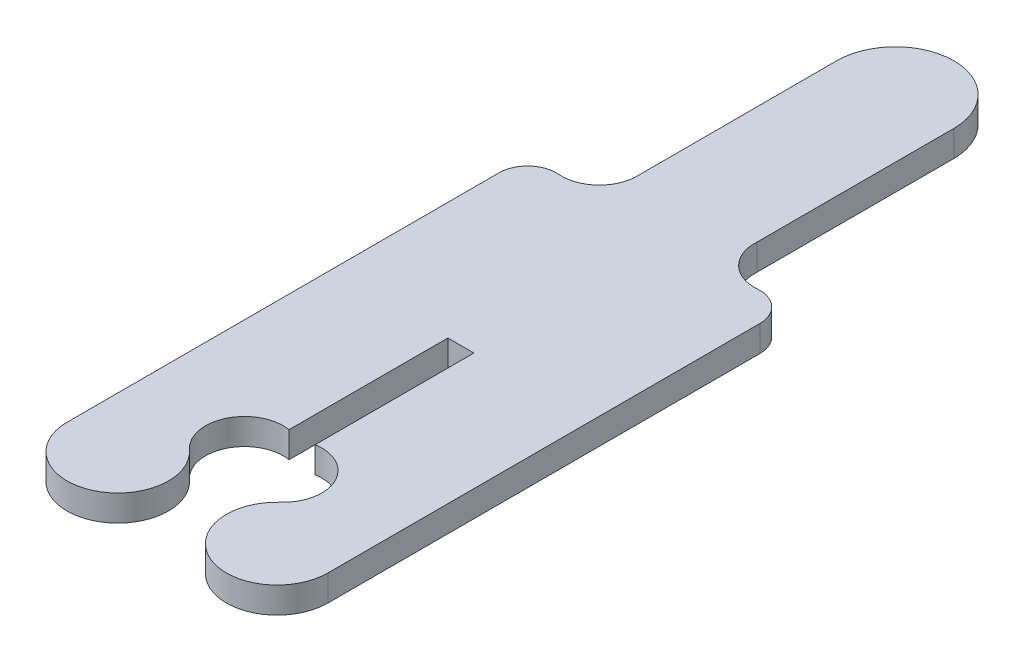
ISO-10303-21;
HEADER;
FILE_DESCRIPTION(('STEP AP214'),'2;1');
FILE_NAME('part.step','',(''),(''),'','','');
FILE_SCHEMA(('AUTOMOTIVE_DESIGN { 1 0 10303 214 1 1 1 1 }'));
ENDSEC;
DATA;
#1=APPLICATION_CONTEXT('core data for automotive mechanical design processes');
#2=APPLICATION_PROTOCOL_DEFINITION('international standard','automotive_design',2000,#1);
#3=PRODUCT_CONTEXT('',#1,'mechanical');
#4=PRODUCT('Part','Part','',(#3));
#5=PRODUCT_RELATED_PRODUCT_CATEGORY('part','',(#4));
#6=PRODUCT_DEFINITION_FORMATION('','',#4);
#7=PRODUCT_DEFINITION_CONTEXT('part definition',#1,'design');
#8=PRODUCT_DEFINITION('design','',#6,#7);
#9=PRODUCT_DEFINITION_SHAPE('','',#8);
#10=(LENGTH_UNIT() NAMED_UNIT(*) SI_UNIT(.MILLI.,.METRE.));
#11=(NAMED_UNIT(*) PLANE_ANGLE_UNIT() SI_UNIT($,.RADIAN.));
#12=(NAMED_UNIT(*) SI_UNIT($,.STERADIAN.) SOLID_ANGLE_UNIT());
#13=UNCERTAINTY_MEASURE_WITH_UNIT(LENGTH_MEASURE(1.E-05),#10,'distance_accuracy_value','');
#14=(GEOMETRIC_REPRESENTATION_CONTEXT(3) GLOBAL_UNCERTAINTY_ASSIGNED_CONTEXT((#13)) GLOBAL_UNIT_ASSIGNED_CONTEXT((#10,
#11,#12)) REPRESENTATION_CONTEXT('',''));
#15=CARTESIAN_POINT('',(0.,0.,0.));
#16=DIRECTION('',(0.,0.,1.));
#17=DIRECTION('',(1.,0.,0.));
#18=AXIS2_PLACEMENT_3D('',#15,#16,#17);
#19=CARTESIAN_POINT('',(-41777.0225889867,3.,-18289.7814477711));
#20=DIRECTION('',(0.,-1.,0.));
#21=DIRECTION('',(0.,0.,-1.));
#22=AXIS2_PLACEMENT_3D('',#19,#20,#21);
#23=CYLINDRICAL_SURFACE('',#22,4.47729575940053);
#24=CARTESIAN_POINT('',(-41777.0225889867,0.,-18289.7814477711));
#25=DIRECTION('',(0.,-1.,0.));
#26=DIRECTION('',(0.,0.,1.));
#27=AXIS2_PLACEMENT_3D('',#24,#25,#26);
#28=CIRCLE('',#27,4.47729575940053);
#29=CARTESIAN_POINT('',(-41777.738281,0.,-18294.201172));
#30=VERTEX_POINT('',#29);
#31=CARTESIAN_POINT('',(-41774.003968,0.,-18286.474772));
#32=VERTEX_POINT('',#31);
#33=EDGE_CURVE('E179',#30,#32,#28,.T.);
#34=ORIENTED_EDGE('',*,*,#33,.T.);
#35=DIRECTION('',(0.,-1.,0.));
#36=VECTOR('',#35,1.);
#37=CARTESIAN_POINT('',(-41774.003968,3.,-18286.474772));
#38=LINE('',#37,#36);
#39=CARTESIAN_POINT('',(-41774.003968,3.,-18286.474772));
#40=VERTEX_POINT('',#39);
#41=EDGE_CURVE('E11',#40,#32,#38,.T.);
#42=ORIENTED_EDGE('',*,*,#41,.F.);
#43=CARTESIAN_POINT('',(-41777.0225889867,3.,-18289.7814477711));
#44=DIRECTION('',(0.,-1.,0.));
#45=DIRECTION('',(0.,0.,1.));
#46=AXIS2_PLACEMENT_3D('',#43,#44,#45);
#47=CIRCLE('',#46,4.47729575940053);
#48=CARTESIAN_POINT('',(-41777.738281,3.,-18294.201172));
#49=VERTEX_POINT('',#48);
#50=EDGE_CURVE('E209',#49,#40,#47,.T.);
#51=ORIENTED_EDGE('',*,*,#50,.F.);
#52=DIRECTION('',(0.,-1.,0.));
#53=VECTOR('',#52,1.);
#54=CARTESIAN_POINT('',(-41777.738281,3.,-18294.201172));
#55=LINE('',#54,#53);
#56=EDGE_CURVE('E175',#49,#30,#55,.T.);
#57=ORIENTED_EDGE('',*,*,#56,.T.);
#58=EDGE_LOOP('',(#34,#42,#51,#57));
#59=FACE_BOUND('',#58,.T.);
#60=ADVANCED_FACE('F35',(#59),#23,.F.);
#61=CARTESIAN_POINT('',(-41770.0709351856,3.,-18282.1623839728));
#62=DIRECTION('',(0.,-1.,0.));
#63=DIRECTION('',(0.,0.,-1.));
#64=AXIS2_PLACEMENT_3D('',#61,#62,#63);
#65=CYLINDRICAL_SURFACE('',#64,5.83656042680733);
#66=CARTESIAN_POINT('',(-41770.0709351856,0.,-18282.1623839728));
#67=DIRECTION('',(0.,1.,0.));
#68=DIRECTION('',(0.,0.,1.));
#69=AXIS2_PLACEMENT_3D('',#66,#67,#68);
#70=CIRCLE('',#69,5.83656042680733);
#71=CARTESIAN_POINT('',(-41764.234375,0.,-18282.164062));
#72=VERTEX_POINT('',#71);
#73=EDGE_CURVE('E182',#32,#72,#70,.T.);
#74=ORIENTED_EDGE('',*,*,#73,.T.);
#75=DIRECTION('',(0.,-1.,0.));
#76=VECTOR('',#75,1.);
#77=CARTESIAN_POINT('',(-41764.234375,3.,-18282.164062));
#78=LINE('',#77,#76);
#79=CARTESIAN_POINT('',(-41764.234375,3.,-18282.164062));
#80=VERTEX_POINT('',#79);
#81=EDGE_CURVE('E43',#80,#72,#78,.T.);
#82=ORIENTED_EDGE('',*,*,#81,.F.);
#83=CARTESIAN_POINT('',(-41770.0709351856,3.,-18282.1623839728));
#84=DIRECTION('',(0.,1.,0.));
#85=DIRECTION('',(0.,0.,1.));
#86=AXIS2_PLACEMENT_3D('',#83,#84,#85);
#87=CIRCLE('',#86,5.83656042680733);
#88=EDGE_CURVE('E118',#40,#80,#87,.T.);
#89=ORIENTED_EDGE('',*,*,#88,.F.);
#90=ORIENTED_EDGE('',*,*,#41,.T.);
#91=EDGE_LOOP('',(#74,#82,#89,#90));
#92=FACE_BOUND('',#91,.T.);
#93=ADVANCED_FACE('F307',(#92),#65,.T.);
#94=CARTESIAN_POINT('',(-41764.2415839999,3.,-18331.840166));
#95=DIRECTION('',(-0.999999989470082,0.,0.000145120072777527));
#96=DIRECTION('',(0.000145120072777527,0.,0.999999989470082));
#97=AXIS2_PLACEMENT_3D('',#94,#95,#96);
#98=PLANE('',#97);
#99=DIRECTION('',(-0.000145120072777527,0.,-0.999999989470082));
#100=VECTOR('',#99,1.);
#101=CARTESIAN_POINT('',(-41764.2415839999,0.,-18331.840166));
#102=LINE('',#101,#100);
#103=CARTESIAN_POINT('',(-41764.2415839999,0.,-18331.840166));
#104=VERTEX_POINT('',#103);
#105=EDGE_CURVE('E184',#72,#104,#102,.T.);
#106=ORIENTED_EDGE('',*,*,#105,.T.);
#107=DIRECTION('',(0.,-1.,0.));
#108=VECTOR('',#107,1.);
#109=CARTESIAN_POINT('',(-41764.2415839999,3.,-18331.840166));
#110=LINE('',#109,#108);
#111=CARTESIAN_POINT('',(-41764.2415839999,3.,-18331.840166));
#112=VERTEX_POINT('',#111);
#113=EDGE_CURVE('E240',#112,#104,#110,.T.);
#114=ORIENTED_EDGE('',*,*,#113,.F.);
#115=DIRECTION('',(-0.000145120072777527,0.,-0.999999989470082));
#116=VECTOR('',#115,1.);
#117=CARTESIAN_POINT('',(-41764.2415839999,3.,-18331.840166));
#118=LINE('',#117,#116);
#119=EDGE_CURVE('E248',#80,#112,#118,.T.);
#120=ORIENTED_EDGE('',*,*,#119,.F.);
#121=ORIENTED_EDGE('',*,*,#81,.T.);
#122=EDGE_LOOP('',(#106,#114,#120,#121));
#123=FACE_BOUND('',#122,.T.);
#124=ADVANCED_FACE('F246',(#123),#98,.F.);
#125=CARTESIAN_POINT('',(-41767.5394138388,3.,-18331.8401681486));
#126=DIRECTION('',(0.,-1.,0.));
#127=DIRECTION('',(0.,0.,-1.));
#128=AXIS2_PLACEMENT_3D('',#125,#126,#127);
#129=CYLINDRICAL_SURFACE('',#128,3.29782983887451);
#130=CARTESIAN_POINT('',(-41767.5394138388,0.,-18331.8401681486));
#131=DIRECTION('',(0.,1.,0.));
#132=DIRECTION('',(0.,0.,1.));
#133=AXIS2_PLACEMENT_3D('',#130,#131,#132);
#134=CIRCLE('',#133,3.29782983887451);
#135=CARTESIAN_POINT('',(-41767.8091419999,0.,-18335.126949));
#136=VERTEX_POINT('',#135);
#137=EDGE_CURVE('E186',#104,#136,#134,.T.);
#138=ORIENTED_EDGE('',*,*,#137,.T.);
#139=DIRECTION('',(0.,-1.,0.));
#140=VECTOR('',#139,1.);
#141=CARTESIAN_POINT('',(-41767.8091419999,3.,-18335.126949));
#142=LINE('',#141,#140);
#143=CARTESIAN_POINT('',(-41767.8091419999,3.,-18335.126949));
#144=VERTEX_POINT('',#143);
#145=EDGE_CURVE('E237',#144,#136,#142,.T.);
#146=ORIENTED_EDGE('',*,*,#145,.F.);
#147=CARTESIAN_POINT('',(-41767.5394138388,3.,-18331.8401681486));
#148=DIRECTION('',(0.,1.,0.));
#149=DIRECTION('',(0.,0.,1.));
#150=AXIS2_PLACEMENT_3D('',#147,#148,#149);
#151=CIRCLE('',#150,3.29782983887451);
#152=EDGE_CURVE('E266',#112,#144,#151,.T.);
#153=ORIENTED_EDGE('',*,*,#152,.F.);
#154=ORIENTED_EDGE('',*,*,#113,.T.);
#155=EDGE_LOOP('',(#138,#146,#153,#154));
#156=FACE_BOUND('',#155,.T.);
#157=ADVANCED_FACE('F257',(#156),#129,.T.);
#158=CARTESIAN_POINT('',(-41768.156767907,3.,-18339.477072009));
#159=DIRECTION('',(0.,-1.,0.));
#160=DIRECTION('',(0.,0.,-1.));
#161=AXIS2_PLACEMENT_3D('',#158,#159,#160);
#162=CYLINDRICAL_SURFACE('',#161,4.36399060089842);
#163=CARTESIAN_POINT('',(-41768.156767907,0.,-18339.477072009));
#164=DIRECTION('',(0.,-1.,0.));
#165=DIRECTION('',(0.,0.,1.));
#166=AXIS2_PLACEMENT_3D('',#163,#164,#165);
#167=CIRCLE('',#166,4.36399060089842);
#168=CARTESIAN_POINT('',(-41772.511719,0.,-18339.757812));
#169=VERTEX_POINT('',#168);
#170=EDGE_CURVE('E188',#136,#169,#167,.T.);
#171=ORIENTED_EDGE('',*,*,#170,.T.);
#172=DIRECTION('',(0.,-1.,0.));
#173=VECTOR('',#172,1.);
#174=CARTESIAN_POINT('',(-41772.511719,3.,-18339.757812));
#175=LINE('',#174,#173);
#176=CARTESIAN_POINT('',(-41772.511719,3.,-18339.757812));
#177=VERTEX_POINT('',#176);
#178=EDGE_CURVE('E234',#177,#169,#175,.T.);
#179=ORIENTED_EDGE('',*,*,#178,.F.);
#180=CARTESIAN_POINT('',(-41768.156767907,3.,-18339.477072009));
#181=DIRECTION('',(0.,-1.,0.));
#182=DIRECTION('',(0.,0.,1.));
#183=AXIS2_PLACEMENT_3D('',#180,#181,#182);
#184=CIRCLE('',#183,4.36399060089842);
#185=EDGE_CURVE('E263',#144,#177,#184,.T.);
#186=ORIENTED_EDGE('',*,*,#185,.F.);
#187=ORIENTED_EDGE('',*,*,#145,.T.);
#188=EDGE_LOOP('',(#171,#179,#186,#187));
#189=FACE_BOUND('',#188,.T.);
#190=ADVANCED_FACE('F261',(#189),#162,.F.);
#191=CARTESIAN_POINT('',(-41772.5146589999,3.,-18362.419881));
#192=DIRECTION('',(-0.999999991584779,0.,0.000129732193163308));
#193=DIRECTION('',(0.000129732193163308,0.,0.999999991584779));
#194=AXIS2_PLACEMENT_3D('',#191,#192,#193);
#195=PLANE('',#194);
#196=DIRECTION('',(-0.000129732193163308,0.,-0.999999991584779));
#197=VECTOR('',#196,1.);
#198=CARTESIAN_POINT('',(-41772.5146589999,0.,-18362.419881));
#199=LINE('',#198,#197);
#200=CARTESIAN_POINT('',(-41772.5146589999,0.,-18362.419881));
#201=VERTEX_POINT('',#200);
#202=EDGE_CURVE('E190',#169,#201,#199,.T.);
#203=ORIENTED_EDGE('',*,*,#202,.T.);
#204=DIRECTION('',(0.,-1.,0.));
#205=VECTOR('',#204,1.);
#206=CARTESIAN_POINT('',(-41772.5146589999,3.,-18362.419881));
#207=LINE('',#206,#205);
#208=CARTESIAN_POINT('',(-41772.5146589999,3.,-18362.419881));
#209=VERTEX_POINT('',#208);
#210=EDGE_CURVE('E231',#209,#201,#207,.T.);
#211=ORIENTED_EDGE('',*,*,#210,.F.);
#212=DIRECTION('',(-0.000129732193163308,0.,-0.999999991584779));
#213=VECTOR('',#212,1.);
#214=CARTESIAN_POINT('',(-41772.5146589999,3.,-18362.419881));
#215=LINE('',#214,#213);
#216=EDGE_CURVE('E265',#177,#209,#215,.T.);
#217=ORIENTED_EDGE('',*,*,#216,.F.);
#218=ORIENTED_EDGE('',*,*,#178,.T.);
#219=EDGE_LOOP('',(#203,#211,#217,#218));
#220=FACE_BOUND('',#219,.T.);
#221=ADVANCED_FACE('F320',(#220),#195,.F.);
#222=CARTESIAN_POINT('',(-41779.2495169999,3.,-18362.4199237823));
#223=DIRECTION('',(0.,-1.,0.));
#224=DIRECTION('',(0.,0.,-1.));
#225=AXIS2_PLACEMENT_3D('',#222,#223,#224);
#226=CYLINDRICAL_SURFACE('',#225,6.73485800009799);
#227=CARTESIAN_POINT('',(-41779.2495169999,0.,-18362.4199237823));
#228=DIRECTION('',(0.,1.,0.));
#229=DIRECTION('',(0.,0.,1.));
#230=AXIS2_PLACEMENT_3D('',#227,#228,#229);
#231=CIRCLE('',#230,6.73485800009799);
#232=CARTESIAN_POINT('',(-41785.984375,0.,-18362.419922));
#233=VERTEX_POINT('',#232);
#234=EDGE_CURVE('E192',#201,#233,#231,.T.);
#235=ORIENTED_EDGE('',*,*,#234,.T.);
#236=DIRECTION('',(0.,-1.,0.));
#237=VECTOR('',#236,1.);
#238=CARTESIAN_POINT('',(-41785.984375,3.,-18362.419922));
#239=LINE('',#238,#237);
#240=CARTESIAN_POINT('',(-41785.984375,3.,-18362.419922));
#241=VERTEX_POINT('',#240);
#242=EDGE_CURVE('E228',#241,#233,#239,.T.);
#243=ORIENTED_EDGE('',*,*,#242,.F.);
#244=CARTESIAN_POINT('',(-41779.2495169999,3.,-18362.4199237823));
#245=DIRECTION('',(0.,1.,0.));
#246=DIRECTION('',(0.,0.,1.));
#247=AXIS2_PLACEMENT_3D('',#244,#245,#246);
#248=CIRCLE('',#247,6.73485800009799);
#249=EDGE_CURVE('E268',#209,#241,#248,.T.);
#250=ORIENTED_EDGE('',*,*,#249,.F.);
#251=ORIENTED_EDGE('',*,*,#210,.T.);
#252=EDGE_LOOP('',(#235,#243,#250,#251));
#253=FACE_BOUND('',#252,.T.);
#254=ADVANCED_FACE('F323',(#253),#226,.T.);
#255=CARTESIAN_POINT('',(-41785.977895,3.,-18339.757464));
#256=DIRECTION('',(0.999999959120463,0.,-0.000285935432879624));
#257=DIRECTION('',(-0.000285935432879624,0.,-0.999999959120463));
#258=AXIS2_PLACEMENT_3D('',#255,#256,#257);
#259=PLANE('',#258);
#260=DIRECTION('',(0.000285935432879624,0.,0.999999959120463));
#261=VECTOR('',#260,1.);
#262=CARTESIAN_POINT('',(-41785.977895,0.,-18339.757464));
#263=LINE('',#262,#261);
#264=CARTESIAN_POINT('',(-41785.977895,0.,-18339.757464));
#265=VERTEX_POINT('',#264);
#266=EDGE_CURVE('E194',#233,#265,#263,.T.);
#267=ORIENTED_EDGE('',*,*,#266,.T.);
#268=DIRECTION('',(0.,-1.,0.));
#269=VECTOR('',#268,1.);
#270=CARTESIAN_POINT('',(-41785.977895,3.,-18339.757464));
#271=LINE('',#270,#269);
#272=CARTESIAN_POINT('',(-41785.977895,3.,-18339.757464));
#273=VERTEX_POINT('',#272);
#274=EDGE_CURVE('E225',#273,#265,#271,.T.);
#275=ORIENTED_EDGE('',*,*,#274,.F.);
#276=DIRECTION('',(0.000285935432879624,0.,0.999999959120463));
#277=VECTOR('',#276,1.);
#278=CARTESIAN_POINT('',(-41785.977895,3.,-18339.757464));
#279=LINE('',#278,#277);
#280=EDGE_CURVE('E274',#241,#273,#279,.T.);
#281=ORIENTED_EDGE('',*,*,#280,.F.);
#282=ORIENTED_EDGE('',*,*,#242,.T.);
#283=EDGE_LOOP('',(#267,#275,#281,#282));
#284=FACE_BOUND('',#283,.T.);
#285=ADVANCED_FACE('F327',(#284),#259,.F.);
#286=CARTESIAN_POINT('',(-41790.332211902,3.,-18339.4724777387));
#287=DIRECTION('',(0.,-1.,0.));
#288=DIRECTION('',(0.,0.,-1.));
#289=AXIS2_PLACEMENT_3D('',#286,#287,#288);
#290=CYLINDRICAL_SURFACE('',#289,4.36363298780015);
#291=CARTESIAN_POINT('',(-41790.332211902,0.,-18339.4724777387));
#292=DIRECTION('',(0.,-1.,0.));
#293=DIRECTION('',(0.,0.,1.));
#294=AXIS2_PLACEMENT_3D('',#291,#292,#293);
#295=CIRCLE('',#294,4.36363298780015);
#296=CARTESIAN_POINT('',(-41790.681193,0.,-18335.122822));
#297=VERTEX_POINT('',#296);
#298=EDGE_CURVE('E196',#265,#297,#295,.T.);
#299=ORIENTED_EDGE('',*,*,#298,.T.);
#300=DIRECTION('',(0.,-1.,0.));
#301=VECTOR('',#300,1.);
#302=CARTESIAN_POINT('',(-41790.681193,3.,-18335.122822));
#303=LINE('',#302,#301);
#304=CARTESIAN_POINT('',(-41790.681193,3.,-18335.122822));
#305=VERTEX_POINT('',#304);
#306=EDGE_CURVE('E222',#305,#297,#303,.T.);
#307=ORIENTED_EDGE('',*,*,#306,.F.);
#308=CARTESIAN_POINT('',(-41790.332211902,3.,-18339.4724777387));
#309=DIRECTION('',(0.,-1.,0.));
#310=DIRECTION('',(0.,0.,1.));
#311=AXIS2_PLACEMENT_3D('',#308,#309,#310);
#312=CIRCLE('',#311,4.36363298780015);
#313=EDGE_CURVE('E276',#273,#305,#312,.T.);
#314=ORIENTED_EDGE('',*,*,#313,.F.);
#315=ORIENTED_EDGE('',*,*,#274,.T.);
#316=EDGE_LOOP('',(#299,#307,#314,#315));
#317=FACE_BOUND('',#316,.T.);
#318=ADVANCED_FACE('F331',(#317),#290,.F.);
#319=CARTESIAN_POINT('',(-41790.9450097132,3.,-18331.8362160181));
#320=DIRECTION('',(0.,-1.,0.));
#321=DIRECTION('',(0.,0.,-1.));
#322=AXIS2_PLACEMENT_3D('',#319,#320,#321);
#323=CYLINDRICAL_SURFACE('',#322,3.29717729860447);
#324=CARTESIAN_POINT('',(-41790.9450097132,0.,-18331.8362160181));
#325=DIRECTION('',(0.,1.,0.));
#326=DIRECTION('',(0.,0.,1.));
#327=AXIS2_PLACEMENT_3D('',#324,#325,#326);
#328=CIRCLE('',#327,3.29717729860447);
#329=CARTESIAN_POINT('',(-41794.242187,0.,-18331.835937));
#330=VERTEX_POINT('',#329);
#331=EDGE_CURVE('E198',#297,#330,#328,.T.);
#332=ORIENTED_EDGE('',*,*,#331,.T.);
#333=DIRECTION('',(0.,-1.,0.));
#334=VECTOR('',#333,1.);
#335=CARTESIAN_POINT('',(-41794.242187,3.,-18331.835937));
#336=LINE('',#335,#334);
#337=CARTESIAN_POINT('',(-41794.242187,3.,-18331.835937));
#338=VERTEX_POINT('',#337);
#339=EDGE_CURVE('E219',#338,#330,#336,.T.);
#340=ORIENTED_EDGE('',*,*,#339,.F.);
#341=CARTESIAN_POINT('',(-41790.9450097132,3.,-18331.8362160181));
#342=DIRECTION('',(0.,1.,0.));
#343=DIRECTION('',(0.,0.,1.));
#344=AXIS2_PLACEMENT_3D('',#341,#342,#343);
#345=CIRCLE('',#344,3.29717729860447);
#346=EDGE_CURVE('E278',#305,#338,#345,.T.);
#347=ORIENTED_EDGE('',*,*,#346,.F.);
#348=ORIENTED_EDGE('',*,*,#306,.T.);
#349=EDGE_LOOP('',(#332,#340,#347,#348));
#350=FACE_BOUND('',#349,.T.);
#351=ADVANCED_FACE('F335',(#350),#323,.T.);
#352=CARTESIAN_POINT('',(-41794.239526,3.,-18282.160613));
#353=DIRECTION('',(0.999999998565243,0.,-5.35678441443155E-05));
#354=DIRECTION('',(-5.35678441443155E-05,0.,-0.999999998565243));
#355=AXIS2_PLACEMENT_3D('',#352,#353,#354);
#356=PLANE('',#355);
#357=DIRECTION('',(5.35678441443155E-05,0.,0.999999998565243));
#358=VECTOR('',#357,1.);
#359=CARTESIAN_POINT('',(-41794.239526,0.,-18282.160613));
#360=LINE('',#359,#358);
#361=CARTESIAN_POINT('',(-41794.239526,0.,-18282.160613));
#362=VERTEX_POINT('',#361);
#363=EDGE_CURVE('E200',#330,#362,#360,.T.);
#364=ORIENTED_EDGE('',*,*,#363,.T.);
#365=DIRECTION('',(0.,-1.,0.));
#366=VECTOR('',#365,1.);
#367=CARTESIAN_POINT('',(-41794.239526,3.,-18282.160613));
#368=LINE('',#367,#366);
#369=CARTESIAN_POINT('',(-41794.239526,3.,-18282.160613));
#370=VERTEX_POINT('',#369);
#371=EDGE_CURVE('E216',#370,#362,#368,.T.);
#372=ORIENTED_EDGE('',*,*,#371,.F.);
#373=DIRECTION('',(5.35678441443155E-05,0.,0.999999998565243));
#374=VECTOR('',#373,1.);
#375=CARTESIAN_POINT('',(-41794.239526,3.,-18282.160613));
#376=LINE('',#375,#374);
#377=EDGE_CURVE('E280',#338,#370,#376,.T.);
#378=ORIENTED_EDGE('',*,*,#377,.F.);
#379=ORIENTED_EDGE('',*,*,#339,.T.);
#380=EDGE_LOOP('',(#364,#372,#378,#379));
#381=FACE_BOUND('',#380,.T.);
#382=ADVANCED_FACE('F339',(#381),#356,.F.);
#383=CARTESIAN_POINT('',(-41788.4018201643,3.,-18282.1623402046));
#384=DIRECTION('',(0.,-1.,0.));
#385=DIRECTION('',(0.,0.,-1.));
#386=AXIS2_PLACEMENT_3D('',#383,#384,#385);
#387=CYLINDRICAL_SURFACE('',#386,5.8377060911862);
#388=CARTESIAN_POINT('',(-41788.4018201643,0.,-18282.1623402046));
#389=DIRECTION('',(0.,1.,0.));
#390=DIRECTION('',(0.,0.,1.));
#391=AXIS2_PLACEMENT_3D('',#388,#389,#390);
#392=CIRCLE('',#391,5.8377060911862);
#393=CARTESIAN_POINT('',(-41784.466445,0.,-18286.474142));
#394=VERTEX_POINT('',#393);
#395=EDGE_CURVE('E202',#362,#394,#392,.T.);
#396=ORIENTED_EDGE('',*,*,#395,.T.);
#397=DIRECTION('',(0.,-1.,0.));
#398=VECTOR('',#397,1.);
#399=CARTESIAN_POINT('',(-41784.466445,3.,-18286.474142));
#400=LINE('',#399,#398);
#401=CARTESIAN_POINT('',(-41784.466445,3.,-18286.474142));
#402=VERTEX_POINT('',#401);
#403=EDGE_CURVE('E213',#402,#394,#400,.T.);
#404=ORIENTED_EDGE('',*,*,#403,.F.);
#405=CARTESIAN_POINT('',(-41788.4018201643,3.,-18282.1623402046));
#406=DIRECTION('',(0.,1.,0.));
#407=DIRECTION('',(0.,0.,1.));
#408=AXIS2_PLACEMENT_3D('',#405,#406,#407);
#409=CIRCLE('',#408,5.8377060911862);
#410=EDGE_CURVE('E282',#370,#402,#409,.T.);
#411=ORIENTED_EDGE('',*,*,#410,.F.);
#412=ORIENTED_EDGE('',*,*,#371,.T.);
#413=EDGE_LOOP('',(#396,#404,#411,#412));
#414=FACE_BOUND('',#413,.T.);
#415=ADVANCED_FACE('F288',(#414),#387,.T.);
#416=CARTESIAN_POINT('',(-41781.4495327531,3.,-18289.782552548));
#417=DIRECTION('',(0.,-1.,0.));
#418=DIRECTION('',(0.,0.,-1.));
#419=AXIS2_PLACEMENT_3D('',#416,#417,#418);
#420=CYLINDRICAL_SURFACE('',#419,4.47742558390155);
#421=CARTESIAN_POINT('',(-41781.4495327531,0.,-18289.782552548));
#422=DIRECTION('',(0.,-1.,0.));
#423=DIRECTION('',(0.,0.,1.));
#424=AXIS2_PLACEMENT_3D('',#421,#422,#423);
#425=CIRCLE('',#424,4.47742558390155);
#426=CARTESIAN_POINT('',(-41780.738281,0.,-18294.203125));
#427=VERTEX_POINT('',#426);
#428=EDGE_CURVE('E204',#394,#427,#425,.T.);
#429=ORIENTED_EDGE('',*,*,#428,.T.);
#430=DIRECTION('',(0.,-1.,0.));
#431=VECTOR('',#430,1.);
#432=CARTESIAN_POINT('',(-41780.738281,3.,-18294.203125));
#433=LINE('',#432,#431);
#434=CARTESIAN_POINT('',(-41780.738281,3.,-18294.203125));
#435=VERTEX_POINT('',#434);
#436=EDGE_CURVE('E170',#435,#427,#433,.T.);
#437=ORIENTED_EDGE('',*,*,#436,.F.);
#438=CARTESIAN_POINT('',(-41781.4495327531,3.,-18289.782552548));
#439=DIRECTION('',(0.,-1.,0.));
#440=DIRECTION('',(0.,0.,1.));
#441=AXIS2_PLACEMENT_3D('',#438,#439,#440);
#442=CIRCLE('',#441,4.47742558390155);
#443=EDGE_CURVE('E161',#402,#435,#442,.T.);
#444=ORIENTED_EDGE('',*,*,#443,.F.);
#445=ORIENTED_EDGE('',*,*,#403,.T.);
#446=EDGE_LOOP('',(#429,#437,#444,#445));
#447=FACE_BOUND('',#446,.T.);
#448=ADVANCED_FACE('F292',(#447),#420,.F.);
#449=CARTESIAN_POINT('',(-41780.738281,3.,-18312.457031));
#450=DIRECTION('',(-1.,0.,0.));
#451=DIRECTION('',(0.,0.,1.));
#452=AXIS2_PLACEMENT_3D('',#449,#450,#451);
#453=PLANE('',#452);
#454=DIRECTION('',(0.,0.,-1.));
#455=VECTOR('',#454,1.);
#456=CARTESIAN_POINT('',(-41780.738281,0.,-18312.457031));
#457=LINE('',#456,#455);
#458=CARTESIAN_POINT('',(-41780.738281,0.,-18312.457031));
#459=VERTEX_POINT('',#458);
#460=EDGE_CURVE('E169',#427,#459,#457,.T.);
#461=ORIENTED_EDGE('',*,*,#460,.T.);
#462=DIRECTION('',(0.,-1.,0.));
#463=VECTOR('',#462,1.);
#464=CARTESIAN_POINT('',(-41780.738281,3.,-18312.457031));
#465=LINE('',#464,#463);
#466=CARTESIAN_POINT('',(-41780.738281,3.,-18312.457031));
#467=VERTEX_POINT('',#466);
#468=EDGE_CURVE('E166',#467,#459,#465,.T.);
#469=ORIENTED_EDGE('',*,*,#468,.F.);
#470=DIRECTION('',(0.,0.,-1.));
#471=VECTOR('',#470,1.);
#472=CARTESIAN_POINT('',(-41780.738281,3.,-18312.457031));
#473=LINE('',#472,#471);
#474=EDGE_CURVE('E155',#435,#467,#473,.T.);
#475=ORIENTED_EDGE('',*,*,#474,.F.);
#476=ORIENTED_EDGE('',*,*,#436,.T.);
#477=EDGE_LOOP('',(#461,#469,#475,#476));
#478=FACE_BOUND('',#477,.T.);
#479=ADVANCED_FACE('F167',(#478),#453,.F.);
#480=CARTESIAN_POINT('',(-41777.742187,3.,-18312.455078));
#481=DIRECTION('',(0.000651848569103873,0.,-0.999999787546699));
#482=DIRECTION('',(-0.999999787546699,0.,-0.000651848569103873));
#483=AXIS2_PLACEMENT_3D('',#480,#481,#482);
#484=PLANE('',#483);
#485=DIRECTION('',(0.999999787546699,0.,0.000651848569103873));
#486=VECTOR('',#485,1.);
#487=CARTESIAN_POINT('',(-41777.742187,0.,-18312.455078));
#488=LINE('',#487,#486);
#489=CARTESIAN_POINT('',(-41777.742187,0.,-18312.455078));
#490=VERTEX_POINT('',#489);
#491=EDGE_CURVE('E104',#459,#490,#488,.T.);
#492=ORIENTED_EDGE('',*,*,#491,.T.);
#493=DIRECTION('',(0.,-1.,0.));
#494=VECTOR('',#493,1.);
#495=CARTESIAN_POINT('',(-41777.742187,3.,-18312.455078));
#496=LINE('',#495,#494);
#497=CARTESIAN_POINT('',(-41777.742187,3.,-18312.455078));
#498=VERTEX_POINT('',#497);
#499=EDGE_CURVE('E171',#498,#490,#496,.T.);
#500=ORIENTED_EDGE('',*,*,#499,.F.);
#501=DIRECTION('',(0.999999787546699,0.,0.000651848569103873));
#502=VECTOR('',#501,1.);
#503=CARTESIAN_POINT('',(-41777.742187,3.,-18312.455078));
#504=LINE('',#503,#502);
#505=EDGE_CURVE('E159',#467,#498,#504,.T.);
#506=ORIENTED_EDGE('',*,*,#505,.F.);
#507=ORIENTED_EDGE('',*,*,#468,.T.);
#508=EDGE_LOOP('',(#492,#500,#506,#507));
#509=FACE_BOUND('',#508,.T.);
#510=ADVANCED_FACE('F173',(#509),#484,.F.);
#511=CARTESIAN_POINT('',(-41777.738281,3.,-18294.201172));
#512=DIRECTION('',(0.999999977105938,0.,-0.000213981593457247));
#513=DIRECTION('',(-0.000213981593457247,0.,-0.999999977105939));
#514=AXIS2_PLACEMENT_3D('',#511,#512,#513);
#515=PLANE('',#514);
#516=DIRECTION('',(0.000213981593457247,0.,0.999999977105939));
#517=VECTOR('',#516,1.);
#518=CARTESIAN_POINT('',(-41777.738281,0.,-18294.201172));
#519=LINE('',#518,#517);
#520=EDGE_CURVE('E110',#490,#30,#519,.T.);
#521=ORIENTED_EDGE('',*,*,#520,.T.);
#522=ORIENTED_EDGE('',*,*,#56,.F.);
#523=DIRECTION('',(0.000213981593457247,0.,0.999999977105939));
#524=VECTOR('',#523,1.);
#525=CARTESIAN_POINT('',(-41777.738281,3.,-18294.201172));
#526=LINE('',#525,#524);
#527=EDGE_CURVE('E51',#498,#49,#526,.T.);
#528=ORIENTED_EDGE('',*,*,#527,.F.);
#529=ORIENTED_EDGE('',*,*,#499,.T.);
#530=EDGE_LOOP('',(#521,#522,#528,#529));
#531=FACE_BOUND('',#530,.T.);
#532=ADVANCED_FACE('F296',(#531),#515,.F.);
#533=CARTESIAN_POINT('',(-41777.0225889867,3.,-18289.7814477711));
#534=DIRECTION('',(0.,1.,0.));
#535=DIRECTION('',(0.,0.,1.));
#536=AXIS2_PLACEMENT_3D('',#533,#534,#535);
#537=PLANE('',#536);
#538=ORIENTED_EDGE('',*,*,#50,.T.);
#539=ORIENTED_EDGE('',*,*,#88,.T.);
#540=ORIENTED_EDGE('',*,*,#119,.T.);
#541=ORIENTED_EDGE('',*,*,#152,.T.);
#542=ORIENTED_EDGE('',*,*,#185,.T.);
#543=ORIENTED_EDGE('',*,*,#216,.T.);
#544=ORIENTED_EDGE('',*,*,#249,.T.);
#545=ORIENTED_EDGE('',*,*,#280,.T.);
#546=ORIENTED_EDGE('',*,*,#313,.T.);
#547=ORIENTED_EDGE('',*,*,#346,.T.);
#548=ORIENTED_EDGE('',*,*,#377,.T.);
#549=ORIENTED_EDGE('',*,*,#410,.T.);
#550=ORIENTED_EDGE('',*,*,#443,.T.);
#551=ORIENTED_EDGE('',*,*,#474,.T.);
#552=ORIENTED_EDGE('',*,*,#505,.T.);
#553=ORIENTED_EDGE('',*,*,#527,.T.);
#554=EDGE_LOOP('',(#538,#539,#540,#541,#542,#543,#544,#545,#546,#547,#548,#549,#550,#551,#552,#553));
#555=FACE_BOUND('',#554,.T.);
#556=ADVANCED_FACE('F157',(#555),#537,.T.);
#557=CARTESIAN_POINT('',(-41777.0225889867,0.,-18289.7814477711));
#558=DIRECTION('',(0.,1.,0.));
#559=DIRECTION('',(0.,0.,1.));
#560=AXIS2_PLACEMENT_3D('',#557,#558,#559);
#561=PLANE('',#560);
#562=ORIENTED_EDGE('',*,*,#33,.F.);
#563=ORIENTED_EDGE('',*,*,#520,.F.);
#564=ORIENTED_EDGE('',*,*,#491,.F.);
#565=ORIENTED_EDGE('',*,*,#460,.F.);
#566=ORIENTED_EDGE('',*,*,#428,.F.);
#567=ORIENTED_EDGE('',*,*,#395,.F.);
#568=ORIENTED_EDGE('',*,*,#363,.F.);
#569=ORIENTED_EDGE('',*,*,#331,.F.);
#570=ORIENTED_EDGE('',*,*,#298,.F.);
#571=ORIENTED_EDGE('',*,*,#266,.F.);
#572=ORIENTED_EDGE('',*,*,#234,.F.);
#573=ORIENTED_EDGE('',*,*,#202,.F.);
#574=ORIENTED_EDGE('',*,*,#170,.F.);
#575=ORIENTED_EDGE('',*,*,#137,.F.);
#576=ORIENTED_EDGE('',*,*,#105,.F.);
#577=ORIENTED_EDGE('',*,*,#73,.F.);
#578=EDGE_LOOP('',(#562,#563,#564,#565,#566,#567,#568,#569,#570,#571,#572,#573,#574,#575,#576,#577));
#579=FACE_BOUND('',#578,.T.);
#580=ADVANCED_FACE('F252',(#579),#561,.F.);
#581=CLOSED_SHELL('',(#60,#93,#124,#157,#190,#221,#254,#285,#318,#351,#382,#415,#448,#479,#510,
#532,#556,#580));
#582=MANIFOLD_SOLID_BREP('B2',#581);
#583=ADVANCED_BREP_SHAPE_REPRESENTATION('',(#18,#582),#14);
#584=SHAPE_DEFINITION_REPRESENTATION(#9,#583);
ENDSEC;
END-ISO-10303-21;
